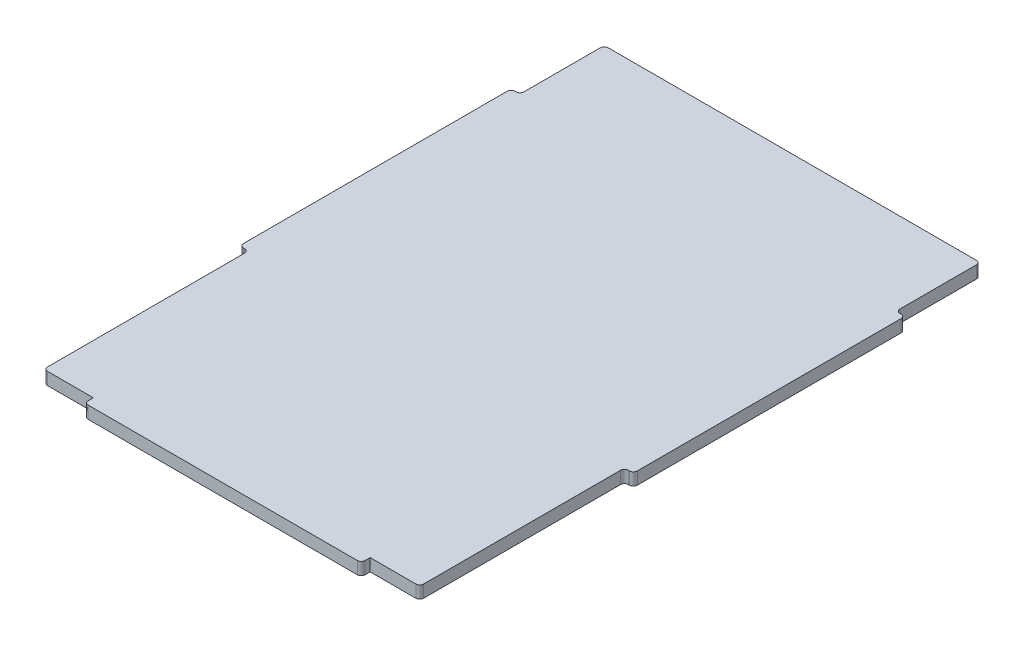
ISO-10303-21;
HEADER;
FILE_DESCRIPTION(('STEP AP214'),'2;1');
FILE_NAME('part.step','',(''),(''),'','','');
FILE_SCHEMA(('AUTOMOTIVE_DESIGN { 1 0 10303 214 1 1 1 1 }'));
ENDSEC;
DATA;
#1=APPLICATION_CONTEXT('core data for automotive mechanical design processes');
#2=APPLICATION_PROTOCOL_DEFINITION('international standard','automotive_design',2000,#1);
#3=PRODUCT_CONTEXT('',#1,'mechanical');
#4=PRODUCT('Part','Part','',(#3));
#5=PRODUCT_RELATED_PRODUCT_CATEGORY('part','',(#4));
#6=PRODUCT_DEFINITION_FORMATION('','',#4);
#7=PRODUCT_DEFINITION_CONTEXT('part definition',#1,'design');
#8=PRODUCT_DEFINITION('design','',#6,#7);
#9=PRODUCT_DEFINITION_SHAPE('','',#8);
#10=(LENGTH_UNIT() NAMED_UNIT(*) SI_UNIT(.MILLI.,.METRE.));
#11=(NAMED_UNIT(*) PLANE_ANGLE_UNIT() SI_UNIT($,.RADIAN.));
#12=(NAMED_UNIT(*) SI_UNIT($,.STERADIAN.) SOLID_ANGLE_UNIT());
#13=UNCERTAINTY_MEASURE_WITH_UNIT(LENGTH_MEASURE(1.E-05),#10,'distance_accuracy_value','');
#14=(GEOMETRIC_REPRESENTATION_CONTEXT(3) GLOBAL_UNCERTAINTY_ASSIGNED_CONTEXT((#13)) GLOBAL_UNIT_ASSIGNED_CONTEXT((#10,
#11,#12)) REPRESENTATION_CONTEXT('',''));
#15=CARTESIAN_POINT('',(0.,0.,0.));
#16=DIRECTION('',(0.,0.,1.));
#17=DIRECTION('',(1.,0.,0.));
#18=AXIS2_PLACEMENT_3D('',#15,#16,#17);
#19=CARTESIAN_POINT('',(96.3803,3.175,0.));
#20=DIRECTION('',(-1.,0.,0.));
#21=DIRECTION('',(0.,0.,1.));
#22=AXIS2_PLACEMENT_3D('',#19,#20,#21);
#23=PLANE('',#22);
#24=DIRECTION('',(0.,0.,-1.));
#25=VECTOR('',#24,1.);
#26=CARTESIAN_POINT('',(96.3803,3.175,0.));
#27=LINE('',#26,#25);
#28=CARTESIAN_POINT('',(96.3803,3.175,-1.));
#29=VERTEX_POINT('',#28);
#30=CARTESIAN_POINT('',(96.3803,3.175,-51.47894));
#31=VERTEX_POINT('',#30);
#32=EDGE_CURVE('E273',#29,#31,#27,.T.);
#33=ORIENTED_EDGE('',*,*,#32,.F.);
#34=DIRECTION('',(0.,-1.,0.));
#35=VECTOR('',#34,1.);
#36=CARTESIAN_POINT('',(96.3803,3.175,-1.));
#37=LINE('',#36,#35);
#38=CARTESIAN_POINT('',(96.3803,0.,-1.));
#39=VERTEX_POINT('',#38);
#40=EDGE_CURVE('E390',#29,#39,#37,.T.);
#41=ORIENTED_EDGE('',*,*,#40,.T.);
#42=DIRECTION('',(0.,0.,-1.));
#43=VECTOR('',#42,1.);
#44=CARTESIAN_POINT('',(96.3803,0.,0.));
#45=LINE('',#44,#43);
#46=CARTESIAN_POINT('',(96.3803,0.,-51.47894));
#47=VERTEX_POINT('',#46);
#48=EDGE_CURVE('E296',#39,#47,#45,.T.);
#49=ORIENTED_EDGE('',*,*,#48,.T.);
#50=DIRECTION('',(0.,-1.,0.));
#51=VECTOR('',#50,1.);
#52=CARTESIAN_POINT('',(96.3803,3.175,-51.47894));
#53=LINE('',#52,#51);
#54=EDGE_CURVE('E388',#47,#31,#53,.F.);
#55=ORIENTED_EDGE('',*,*,#54,.T.);
#56=EDGE_LOOP('',(#33,#41,#49,#55));
#57=FACE_BOUND('',#56,.T.);
#58=ADVANCED_FACE('F35',(#57),#23,.F.);
#59=CARTESIAN_POINT('',(0.,3.175,0.));
#60=DIRECTION('',(1.,0.,0.));
#61=DIRECTION('',(0.,0.,-1.));
#62=AXIS2_PLACEMENT_3D('',#59,#60,#61);
#63=PLANE('',#62);
#64=DIRECTION('',(0.,0.,1.));
#65=VECTOR('',#64,1.);
#66=CARTESIAN_POINT('',(0.,3.175,0.));
#67=LINE('',#66,#65);
#68=CARTESIAN_POINT('',(0.,3.175,-142.6878));
#69=VERTEX_POINT('',#68);
#70=CARTESIAN_POINT('',(0.,3.175,-123.095040291906));
#71=VERTEX_POINT('',#70);
#72=EDGE_CURVE('E245',#69,#71,#67,.T.);
#73=ORIENTED_EDGE('',*,*,#72,.F.);
#74=DIRECTION('',(0.,-1.,0.));
#75=VECTOR('',#74,1.);
#76=CARTESIAN_POINT('',(0.,3.175,-142.6878));
#77=LINE('',#76,#75);
#78=CARTESIAN_POINT('',(0.,0.,-142.6878));
#79=VERTEX_POINT('',#78);
#80=EDGE_CURVE('E354',#69,#79,#77,.T.);
#81=ORIENTED_EDGE('',*,*,#80,.T.);
#82=DIRECTION('',(0.,0.,1.));
#83=VECTOR('',#82,1.);
#84=CARTESIAN_POINT('',(0.,0.,0.));
#85=LINE('',#84,#83);
#86=CARTESIAN_POINT('',(0.,0.,-123.095040291906));
#87=VERTEX_POINT('',#86);
#88=EDGE_CURVE('E282',#79,#87,#85,.T.);
#89=ORIENTED_EDGE('',*,*,#88,.T.);
#90=DIRECTION('',(0.,-1.,0.));
#91=VECTOR('',#90,1.);
#92=CARTESIAN_POINT('',(0.,3.175,-123.095040291906));
#93=LINE('',#92,#91);
#94=EDGE_CURVE('E352',#87,#71,#93,.F.);
#95=ORIENTED_EDGE('',*,*,#94,.T.);
#96=EDGE_LOOP('',(#73,#81,#89,#95));
#97=FACE_BOUND('',#96,.T.);
#98=ADVANCED_FACE('F455',(#97),#63,.F.);
#99=CARTESIAN_POINT('',(0.,3.175,-51.47894));
#100=VERTEX_POINT('',#99);
#101=CARTESIAN_POINT('',(0.,3.175,-1.));
#102=VERTEX_POINT('',#101);
#103=EDGE_CURVE('E302',#100,#102,#67,.T.);
#104=ORIENTED_EDGE('',*,*,#103,.F.);
#105=DIRECTION('',(0.,-1.,0.));
#106=VECTOR('',#105,1.);
#107=CARTESIAN_POINT('',(0.,3.175,-51.47894));
#108=LINE('',#107,#106);
#109=CARTESIAN_POINT('',(0.,0.,-51.47894));
#110=VERTEX_POINT('',#109);
#111=EDGE_CURVE('E374',#100,#110,#108,.T.);
#112=ORIENTED_EDGE('',*,*,#111,.T.);
#113=CARTESIAN_POINT('',(0.,0.,-1.));
#114=VERTEX_POINT('',#113);
#115=EDGE_CURVE('E279',#110,#114,#85,.T.);
#116=ORIENTED_EDGE('',*,*,#115,.T.);
#117=DIRECTION('',(0.,-1.,0.));
#118=VECTOR('',#117,1.);
#119=CARTESIAN_POINT('',(0.,3.175,-1.));
#120=LINE('',#119,#118);
#121=EDGE_CURVE('E372',#114,#102,#120,.F.);
#122=ORIENTED_EDGE('',*,*,#121,.T.);
#123=EDGE_LOOP('',(#104,#112,#116,#122));
#124=FACE_BOUND('',#123,.T.);
#125=ADVANCED_FACE('F542',(#124),#63,.F.);
#126=CARTESIAN_POINT('',(0.,3.175,0.));
#127=DIRECTION('',(0.,0.,-1.));
#128=DIRECTION('',(-1.,0.,0.));
#129=AXIS2_PLACEMENT_3D('',#126,#127,#128);
#130=PLANE('',#129);
#131=DIRECTION('',(1.,0.,0.));
#132=VECTOR('',#131,1.);
#133=CARTESIAN_POINT('',(0.,3.175,0.));
#134=LINE('',#133,#132);
#135=CARTESIAN_POINT('',(1.,3.175,0.));
#136=VERTEX_POINT('',#135);
#137=CARTESIAN_POINT('',(12.7,3.175,0.));
#138=VERTEX_POINT('',#137);
#139=EDGE_CURVE('E232',#136,#138,#134,.T.);
#140=ORIENTED_EDGE('',*,*,#139,.F.);
#141=DIRECTION('',(0.,-1.,0.));
#142=VECTOR('',#141,1.);
#143=CARTESIAN_POINT('',(1.,3.175,0.));
#144=LINE('',#143,#142);
#145=CARTESIAN_POINT('',(1.,0.,0.));
#146=VERTEX_POINT('',#145);
#147=EDGE_CURVE('E377',#136,#146,#144,.T.);
#148=ORIENTED_EDGE('',*,*,#147,.T.);
#149=DIRECTION('',(1.,0.,0.));
#150=VECTOR('',#149,1.);
#151=CARTESIAN_POINT('',(0.,0.,0.));
#152=LINE('',#151,#150);
#153=CARTESIAN_POINT('',(12.7,0.,0.));
#154=VERTEX_POINT('',#153);
#155=EDGE_CURVE('E251',#146,#154,#152,.T.);
#156=ORIENTED_EDGE('',*,*,#155,.T.);
#157=DIRECTION('',(0.,-1.,0.));
#158=VECTOR('',#157,1.);
#159=CARTESIAN_POINT('',(12.7,3.175,0.));
#160=LINE('',#159,#158);
#161=EDGE_CURVE('E248',#138,#154,#160,.T.);
#162=ORIENTED_EDGE('',*,*,#161,.F.);
#163=EDGE_LOOP('',(#140,#148,#156,#162));
#164=FACE_BOUND('',#163,.T.);
#165=ADVANCED_FACE('F249',(#164),#130,.F.);
#166=CARTESIAN_POINT('',(12.7,3.175,2.286));
#167=DIRECTION('',(1.,0.,0.));
#168=DIRECTION('',(0.,0.,-1.));
#169=AXIS2_PLACEMENT_3D('',#166,#167,#168);
#170=PLANE('',#169);
#171=DIRECTION('',(0.,0.,1.));
#172=VECTOR('',#171,1.);
#173=CARTESIAN_POINT('',(12.7,0.,2.286));
#174=LINE('',#173,#172);
#175=CARTESIAN_POINT('',(12.7,0.,1.286));
#176=VERTEX_POINT('',#175);
#177=EDGE_CURVE('E285',#154,#176,#174,.T.);
#178=ORIENTED_EDGE('',*,*,#177,.T.);
#179=DIRECTION('',(0.,-1.,0.));
#180=VECTOR('',#179,1.);
#181=CARTESIAN_POINT('',(12.7,3.175,1.286));
#182=LINE('',#181,#180);
#183=CARTESIAN_POINT('',(12.7,3.175,1.286));
#184=VERTEX_POINT('',#183);
#185=EDGE_CURVE('E260',#176,#184,#182,.F.);
#186=ORIENTED_EDGE('',*,*,#185,.T.);
#187=DIRECTION('',(0.,0.,1.));
#188=VECTOR('',#187,1.);
#189=CARTESIAN_POINT('',(12.7,3.175,2.286));
#190=LINE('',#189,#188);
#191=EDGE_CURVE('E237',#138,#184,#190,.T.);
#192=ORIENTED_EDGE('',*,*,#191,.F.);
#193=ORIENTED_EDGE('',*,*,#161,.T.);
#194=EDGE_LOOP('',(#178,#186,#192,#193));
#195=FACE_BOUND('',#194,.T.);
#196=ADVANCED_FACE('F258',(#195),#170,.F.);
#197=CARTESIAN_POINT('',(12.7,3.175,2.286));
#198=DIRECTION('',(0.,0.,-1.));
#199=DIRECTION('',(-1.,0.,0.));
#200=AXIS2_PLACEMENT_3D('',#197,#198,#199);
#201=PLANE('',#200);
#202=DIRECTION('',(1.,0.,0.));
#203=VECTOR('',#202,1.);
#204=CARTESIAN_POINT('',(12.7,3.175,2.286));
#205=LINE('',#204,#203);
#206=CARTESIAN_POINT('',(13.7,3.175,2.286));
#207=VERTEX_POINT('',#206);
#208=CARTESIAN_POINT('',(82.6803,3.175,2.28599999999999));
#209=VERTEX_POINT('',#208);
#210=EDGE_CURVE('E261',#207,#209,#205,.T.);
#211=ORIENTED_EDGE('',*,*,#210,.F.);
#212=DIRECTION('',(0.,-1.,0.));
#213=VECTOR('',#212,1.);
#214=CARTESIAN_POINT('',(13.7,3.175,2.286));
#215=LINE('',#214,#213);
#216=CARTESIAN_POINT('',(13.7,0.,2.286));
#217=VERTEX_POINT('',#216);
#218=EDGE_CURVE('E381',#207,#217,#215,.T.);
#219=ORIENTED_EDGE('',*,*,#218,.T.);
#220=DIRECTION('',(1.,0.,0.));
#221=VECTOR('',#220,1.);
#222=CARTESIAN_POINT('',(12.7,0.,2.286));
#223=LINE('',#222,#221);
#224=CARTESIAN_POINT('',(82.6803,0.,2.28599999999999));
#225=VERTEX_POINT('',#224);
#226=EDGE_CURVE('E287',#217,#225,#223,.T.);
#227=ORIENTED_EDGE('',*,*,#226,.T.);
#228=DIRECTION('',(0.,-1.,0.));
#229=VECTOR('',#228,1.);
#230=CARTESIAN_POINT('',(82.6803,3.175,2.28599999999999));
#231=LINE('',#230,#229);
#232=EDGE_CURVE('E379',#225,#209,#231,.F.);
#233=ORIENTED_EDGE('',*,*,#232,.T.);
#234=EDGE_LOOP('',(#211,#219,#227,#233));
#235=FACE_BOUND('',#234,.T.);
#236=ADVANCED_FACE('F531',(#235),#201,.F.);
#237=CARTESIAN_POINT('',(83.6803,3.175,2.28599999999999));
#238=DIRECTION('',(-1.,0.,0.));
#239=DIRECTION('',(0.,0.,1.));
#240=AXIS2_PLACEMENT_3D('',#237,#238,#239);
#241=PLANE('',#240);
#242=DIRECTION('',(0.,0.,-1.));
#243=VECTOR('',#242,1.);
#244=CARTESIAN_POINT('',(83.6803,3.175,2.28599999999999));
#245=LINE('',#244,#243);
#246=CARTESIAN_POINT('',(83.6803,3.175,1.28599999999999));
#247=VERTEX_POINT('',#246);
#248=CARTESIAN_POINT('',(83.6803,3.175,0.));
#249=VERTEX_POINT('',#248);
#250=EDGE_CURVE('E264',#247,#249,#245,.T.);
#251=ORIENTED_EDGE('',*,*,#250,.F.);
#252=DIRECTION('',(0.,-1.,0.));
#253=VECTOR('',#252,1.);
#254=CARTESIAN_POINT('',(83.6803,3.175,1.28599999999999));
#255=LINE('',#254,#253);
#256=CARTESIAN_POINT('',(83.6803,0.,1.28599999999999));
#257=VERTEX_POINT('',#256);
#258=EDGE_CURVE('E385',#247,#257,#255,.T.);
#259=ORIENTED_EDGE('',*,*,#258,.T.);
#260=DIRECTION('',(0.,0.,-1.));
#261=VECTOR('',#260,1.);
#262=CARTESIAN_POINT('',(83.6803,0.,2.28599999999999));
#263=LINE('',#262,#261);
#264=CARTESIAN_POINT('',(83.6803,0.,0.));
#265=VERTEX_POINT('',#264);
#266=EDGE_CURVE('E290',#257,#265,#263,.T.);
#267=ORIENTED_EDGE('',*,*,#266,.T.);
#268=DIRECTION('',(0.,-1.,0.));
#269=VECTOR('',#268,1.);
#270=CARTESIAN_POINT('',(83.6803,3.175,0.));
#271=LINE('',#270,#269);
#272=EDGE_CURVE('E256',#249,#265,#271,.T.);
#273=ORIENTED_EDGE('',*,*,#272,.F.);
#274=EDGE_LOOP('',(#251,#259,#267,#273));
#275=FACE_BOUND('',#274,.T.);
#276=ADVANCED_FACE('F524',(#275),#241,.F.);
#277=CARTESIAN_POINT('',(83.6803,3.175,0.));
#278=DIRECTION('',(0.,0.,-1.));
#279=DIRECTION('',(-1.,0.,0.));
#280=AXIS2_PLACEMENT_3D('',#277,#278,#279);
#281=PLANE('',#280);
#282=DIRECTION('',(1.,0.,0.));
#283=VECTOR('',#282,1.);
#284=CARTESIAN_POINT('',(83.6803,0.,0.));
#285=LINE('',#284,#283);
#286=CARTESIAN_POINT('',(95.3803,0.,0.));
#287=VERTEX_POINT('',#286);
#288=EDGE_CURVE('E292',#265,#287,#285,.T.);
#289=ORIENTED_EDGE('',*,*,#288,.T.);
#290=DIRECTION('',(0.,-1.,0.));
#291=VECTOR('',#290,1.);
#292=CARTESIAN_POINT('',(95.3803,3.175,0.));
#293=LINE('',#292,#291);
#294=CARTESIAN_POINT('',(95.3803,3.175,0.));
#295=VERTEX_POINT('',#294);
#296=EDGE_CURVE('E393',#287,#295,#293,.F.);
#297=ORIENTED_EDGE('',*,*,#296,.T.);
#298=DIRECTION('',(1.,0.,0.));
#299=VECTOR('',#298,1.);
#300=CARTESIAN_POINT('',(83.6803,3.175,0.));
#301=LINE('',#300,#299);
#302=EDGE_CURVE('E269',#249,#295,#301,.T.);
#303=ORIENTED_EDGE('',*,*,#302,.F.);
#304=ORIENTED_EDGE('',*,*,#272,.T.);
#305=EDGE_LOOP('',(#289,#297,#303,#304));
#306=FACE_BOUND('',#305,.T.);
#307=ADVANCED_FACE('F519',(#306),#281,.F.);
#308=CARTESIAN_POINT('',(96.3803,0.,-123.095040291906));
#309=VERTEX_POINT('',#308);
#310=CARTESIAN_POINT('',(96.3803,0.,-142.6878));
#311=VERTEX_POINT('',#310);
#312=EDGE_CURVE('E295',#309,#311,#45,.T.);
#313=ORIENTED_EDGE('',*,*,#312,.T.);
#314=DIRECTION('',(0.,-1.,0.));
#315=VECTOR('',#314,1.);
#316=CARTESIAN_POINT('',(96.3803,3.175,-142.6878));
#317=LINE('',#316,#315);
#318=CARTESIAN_POINT('',(96.3803,3.175,-142.6878));
#319=VERTEX_POINT('',#318);
#320=EDGE_CURVE('E332',#311,#319,#317,.F.);
#321=ORIENTED_EDGE('',*,*,#320,.T.);
#322=CARTESIAN_POINT('',(96.3803,3.175,-123.095040291906));
#323=VERTEX_POINT('',#322);
#324=EDGE_CURVE('E272',#323,#319,#27,.T.);
#325=ORIENTED_EDGE('',*,*,#324,.F.);
#326=DIRECTION('',(0.,-1.,0.));
#327=VECTOR('',#326,1.);
#328=CARTESIAN_POINT('',(96.3803,3.175,-123.095040291906));
#329=LINE('',#328,#327);
#330=EDGE_CURVE('E329',#323,#309,#329,.T.);
#331=ORIENTED_EDGE('',*,*,#330,.T.);
#332=EDGE_LOOP('',(#313,#321,#325,#331));
#333=FACE_BOUND('',#332,.T.);
#334=ADVANCED_FACE('F438',(#333),#23,.F.);
#335=CARTESIAN_POINT('',(0.,3.175,-143.6878));
#336=DIRECTION('',(0.,0.,1.));
#337=DIRECTION('',(1.,0.,0.));
#338=AXIS2_PLACEMENT_3D('',#335,#336,#337);
#339=PLANE('',#338);
#340=DIRECTION('',(-1.,0.,0.));
#341=VECTOR('',#340,1.);
#342=CARTESIAN_POINT('',(0.,3.175,-143.6878));
#343=LINE('',#342,#341);
#344=CARTESIAN_POINT('',(95.3803,3.175,-143.6878));
#345=VERTEX_POINT('',#344);
#346=CARTESIAN_POINT('',(1.,3.175,-143.6878));
#347=VERTEX_POINT('',#346);
#348=EDGE_CURVE('E276',#345,#347,#343,.T.);
#349=ORIENTED_EDGE('',*,*,#348,.F.);
#350=DIRECTION('',(0.,-1.,0.));
#351=VECTOR('',#350,1.);
#352=CARTESIAN_POINT('',(95.3803,3.175,-143.6878));
#353=LINE('',#352,#351);
#354=CARTESIAN_POINT('',(95.3803,0.,-143.6878));
#355=VERTEX_POINT('',#354);
#356=EDGE_CURVE('E306',#345,#355,#353,.T.);
#357=ORIENTED_EDGE('',*,*,#356,.T.);
#358=DIRECTION('',(-1.,0.,0.));
#359=VECTOR('',#358,1.);
#360=CARTESIAN_POINT('',(0.,0.,-143.6878));
#361=LINE('',#360,#359);
#362=CARTESIAN_POINT('',(1.,0.,-143.6878));
#363=VERTEX_POINT('',#362);
#364=EDGE_CURVE('E299',#355,#363,#361,.T.);
#365=ORIENTED_EDGE('',*,*,#364,.T.);
#366=DIRECTION('',(0.,-1.,0.));
#367=VECTOR('',#366,1.);
#368=CARTESIAN_POINT('',(1.,3.175,-143.6878));
#369=LINE('',#368,#367);
#370=EDGE_CURVE('E255',#363,#347,#369,.F.);
#371=ORIENTED_EDGE('',*,*,#370,.T.);
#372=EDGE_LOOP('',(#349,#357,#365,#371));
#373=FACE_BOUND('',#372,.T.);
#374=ADVANCED_FACE('F446',(#373),#339,.F.);
#375=CARTESIAN_POINT('',(0.,3.175,0.));
#376=DIRECTION('',(0.,-1.,0.));
#377=DIRECTION('',(0.,0.,-1.));
#378=AXIS2_PLACEMENT_3D('',#375,#376,#377);
#379=PLANE('',#378);
#380=ORIENTED_EDGE('',*,*,#324,.T.);
#381=CARTESIAN_POINT('',(95.3803,3.175,-142.6878));
#382=DIRECTION('',(0.,-1.,0.));
#383=DIRECTION('',(0.,0.,-1.));
#384=AXIS2_PLACEMENT_3D('',#381,#382,#383);
#385=CIRCLE('',#384,1.);
#386=EDGE_CURVE('E350',#319,#345,#385,.F.);
#387=ORIENTED_EDGE('',*,*,#386,.T.);
#388=ORIENTED_EDGE('',*,*,#348,.T.);
#389=CARTESIAN_POINT('',(1.,3.175,-142.6878));
#390=DIRECTION('',(0.,-1.,0.));
#391=DIRECTION('',(0.,0.,-1.));
#392=AXIS2_PLACEMENT_3D('',#389,#390,#391);
#393=CIRCLE('',#392,1.);
#394=EDGE_CURVE('E348',#347,#69,#393,.F.);
#395=ORIENTED_EDGE('',*,*,#394,.T.);
#396=ORIENTED_EDGE('',*,*,#72,.T.);
#397=CARTESIAN_POINT('',(-1.,3.175,-123.095040291906));
#398=DIRECTION('',(0.,-1.,0.));
#399=DIRECTION('',(0.,0.,-1.));
#400=AXIS2_PLACEMENT_3D('',#397,#398,#399);
#401=CIRCLE('',#400,1.);
#402=CARTESIAN_POINT('',(-1.,3.175,-122.095040291906));
#403=VERTEX_POINT('',#402);
#404=EDGE_CURVE('E411',#71,#403,#401,.T.);
#405=ORIENTED_EDGE('',*,*,#404,.T.);
#406=DIRECTION('',(1.,0.,0.));
#407=VECTOR('',#406,1.);
#408=CARTESIAN_POINT('',(0.,3.175,-122.095040291906));
#409=LINE('',#408,#407);
#410=CARTESIAN_POINT('',(-1.28599999999999,3.175,-122.095040291906));
#411=VERTEX_POINT('',#410);
#412=EDGE_CURVE('E283',#411,#403,#409,.T.);
#413=ORIENTED_EDGE('',*,*,#412,.F.);
#414=CARTESIAN_POINT('',(-1.28599999999999,3.175,-121.095040291906));
#415=DIRECTION('',(0.,-1.,0.));
#416=DIRECTION('',(0.,0.,-1.));
#417=AXIS2_PLACEMENT_3D('',#414,#415,#416);
#418=CIRCLE('',#417,1.);
#419=CARTESIAN_POINT('',(-2.28599999999999,3.175,-121.095040291906));
#420=VERTEX_POINT('',#419);
#421=EDGE_CURVE('E346',#411,#420,#418,.F.);
#422=ORIENTED_EDGE('',*,*,#421,.T.);
#423=DIRECTION('',(0.,0.,-1.));
#424=VECTOR('',#423,1.);
#425=CARTESIAN_POINT('',(-2.286,3.175,-52.47894));
#426=LINE('',#425,#424);
#427=CARTESIAN_POINT('',(-2.286,3.175,-53.47894));
#428=VERTEX_POINT('',#427);
#429=EDGE_CURVE('E473',#428,#420,#426,.T.);
#430=ORIENTED_EDGE('',*,*,#429,.F.);
#431=CARTESIAN_POINT('',(-1.286,3.175,-53.47894));
#432=DIRECTION('',(0.,-1.,0.));
#433=DIRECTION('',(0.,0.,-1.));
#434=AXIS2_PLACEMENT_3D('',#431,#432,#433);
#435=CIRCLE('',#434,1.);
#436=CARTESIAN_POINT('',(-1.286,3.175,-52.47894));
#437=VERTEX_POINT('',#436);
#438=EDGE_CURVE('E344',#428,#437,#435,.F.);
#439=ORIENTED_EDGE('',*,*,#438,.T.);
#440=DIRECTION('',(-1.,0.,0.));
#441=VECTOR('',#440,1.);
#442=CARTESIAN_POINT('',(0.,3.175,-52.47894));
#443=LINE('',#442,#441);
#444=CARTESIAN_POINT('',(-1.,3.175,-52.47894));
#445=VERTEX_POINT('',#444);
#446=EDGE_CURVE('E463',#445,#437,#443,.T.);
#447=ORIENTED_EDGE('',*,*,#446,.F.);
#448=CARTESIAN_POINT('',(-1.,3.175,-51.47894));
#449=DIRECTION('',(0.,-1.,0.));
#450=DIRECTION('',(0.,0.,-1.));
#451=AXIS2_PLACEMENT_3D('',#448,#449,#450);
#452=CIRCLE('',#451,1.);
#453=EDGE_CURVE('E415',#445,#100,#452,.T.);
#454=ORIENTED_EDGE('',*,*,#453,.T.);
#455=ORIENTED_EDGE('',*,*,#103,.T.);
#456=CARTESIAN_POINT('',(1.,3.175,-1.));
#457=DIRECTION('',(0.,-1.,0.));
#458=DIRECTION('',(0.,0.,-1.));
#459=AXIS2_PLACEMENT_3D('',#456,#457,#458);
#460=CIRCLE('',#459,1.);
#461=EDGE_CURVE('E241',#102,#136,#460,.F.);
#462=ORIENTED_EDGE('',*,*,#461,.T.);
#463=ORIENTED_EDGE('',*,*,#139,.T.);
#464=ORIENTED_EDGE('',*,*,#191,.T.);
#465=CARTESIAN_POINT('',(13.7,3.175,1.286));
#466=DIRECTION('',(0.,-1.,0.));
#467=DIRECTION('',(0.,0.,-1.));
#468=AXIS2_PLACEMENT_3D('',#465,#466,#467);
#469=CIRCLE('',#468,1.);
#470=EDGE_CURVE('E341',#184,#207,#469,.F.);
#471=ORIENTED_EDGE('',*,*,#470,.T.);
#472=ORIENTED_EDGE('',*,*,#210,.T.);
#473=CARTESIAN_POINT('',(82.6803,3.175,1.28599999999999));
#474=DIRECTION('',(0.,-1.,0.));
#475=DIRECTION('',(0.,0.,-1.));
#476=AXIS2_PLACEMENT_3D('',#473,#474,#475);
#477=CIRCLE('',#476,1.);
#478=EDGE_CURVE('E339',#209,#247,#477,.F.);
#479=ORIENTED_EDGE('',*,*,#478,.T.);
#480=ORIENTED_EDGE('',*,*,#250,.T.);
#481=ORIENTED_EDGE('',*,*,#302,.T.);
#482=CARTESIAN_POINT('',(95.3803,3.175,-1.));
#483=DIRECTION('',(0.,-1.,0.));
#484=DIRECTION('',(0.,0.,-1.));
#485=AXIS2_PLACEMENT_3D('',#482,#483,#484);
#486=CIRCLE('',#485,1.);
#487=EDGE_CURVE('E337',#295,#29,#486,.F.);
#488=ORIENTED_EDGE('',*,*,#487,.T.);
#489=ORIENTED_EDGE('',*,*,#32,.T.);
#490=CARTESIAN_POINT('',(97.3803,3.175,-51.47894));
#491=DIRECTION('',(0.,-1.,0.));
#492=DIRECTION('',(0.,0.,-1.));
#493=AXIS2_PLACEMENT_3D('',#490,#491,#492);
#494=CIRCLE('',#493,1.);
#495=CARTESIAN_POINT('',(97.3803,3.175,-52.47894));
#496=VERTEX_POINT('',#495);
#497=EDGE_CURVE('E419',#31,#496,#494,.T.);
#498=ORIENTED_EDGE('',*,*,#497,.T.);
#499=DIRECTION('',(-1.,0.,0.));
#500=VECTOR('',#499,1.);
#501=CARTESIAN_POINT('',(96.3803,3.175,-52.47894));
#502=LINE('',#501,#500);
#503=CARTESIAN_POINT('',(97.6663,3.175,-52.47894));
#504=VERTEX_POINT('',#503);
#505=EDGE_CURVE('E470',#504,#496,#502,.T.);
#506=ORIENTED_EDGE('',*,*,#505,.F.);
#507=CARTESIAN_POINT('',(97.6663,3.175,-53.47894));
#508=DIRECTION('',(0.,-1.,0.));
#509=DIRECTION('',(0.,0.,-1.));
#510=AXIS2_PLACEMENT_3D('',#507,#508,#509);
#511=CIRCLE('',#510,1.);
#512=CARTESIAN_POINT('',(98.6663,3.175,-53.47894));
#513=VERTEX_POINT('',#512);
#514=EDGE_CURVE('E335',#504,#513,#511,.F.);
#515=ORIENTED_EDGE('',*,*,#514,.T.);
#516=DIRECTION('',(0.,0.,1.));
#517=VECTOR('',#516,1.);
#518=CARTESIAN_POINT('',(98.6663,3.175,-52.47894));
#519=LINE('',#518,#517);
#520=CARTESIAN_POINT('',(98.6663,3.175,-121.095040291906));
#521=VERTEX_POINT('',#520);
#522=EDGE_CURVE('E485',#521,#513,#519,.T.);
#523=ORIENTED_EDGE('',*,*,#522,.F.);
#524=CARTESIAN_POINT('',(97.6663,3.175,-121.095040291906));
#525=DIRECTION('',(0.,-1.,0.));
#526=DIRECTION('',(0.,0.,-1.));
#527=AXIS2_PLACEMENT_3D('',#524,#525,#526);
#528=CIRCLE('',#527,1.);
#529=CARTESIAN_POINT('',(97.6663,3.175,-122.095040291906));
#530=VERTEX_POINT('',#529);
#531=EDGE_CURVE('E50',#521,#530,#528,.F.);
#532=ORIENTED_EDGE('',*,*,#531,.T.);
#533=DIRECTION('',(1.,0.,0.));
#534=VECTOR('',#533,1.);
#535=CARTESIAN_POINT('',(96.3803,3.175,-122.095040291906));
#536=LINE('',#535,#534);
#537=CARTESIAN_POINT('',(97.3803,3.175,-122.095040291906));
#538=VERTEX_POINT('',#537);
#539=EDGE_CURVE('E436',#538,#530,#536,.T.);
#540=ORIENTED_EDGE('',*,*,#539,.F.);
#541=CARTESIAN_POINT('',(97.3803,3.175,-123.095040291906));
#542=DIRECTION('',(0.,-1.,0.));
#543=DIRECTION('',(0.,0.,-1.));
#544=AXIS2_PLACEMENT_3D('',#541,#542,#543);
#545=CIRCLE('',#544,1.);
#546=EDGE_CURVE('E11',#538,#323,#545,.T.);
#547=ORIENTED_EDGE('',*,*,#546,.T.);
#548=EDGE_LOOP('',(#380,#387,#388,#395,#396,#405,#413,#422,#430,#439,#447,#454,#455,#462,#463,
#464,#471,#472,#479,#480,#481,#488,#489,#498,#506,#515,#523,#532,#540,#547));
#549=FACE_BOUND('',#548,.T.);
#550=ADVANCED_FACE('F235',(#549),#379,.F.);
#551=CARTESIAN_POINT('',(0.,0.,0.));
#552=DIRECTION('',(0.,-1.,0.));
#553=DIRECTION('',(0.,0.,-1.));
#554=AXIS2_PLACEMENT_3D('',#551,#552,#553);
#555=PLANE('',#554);
#556=ORIENTED_EDGE('',*,*,#364,.F.);
#557=CARTESIAN_POINT('',(95.3803,0.,-142.6878));
#558=DIRECTION('',(0.,-1.,0.));
#559=DIRECTION('',(0.,0.,-1.));
#560=AXIS2_PLACEMENT_3D('',#557,#558,#559);
#561=CIRCLE('',#560,1.);
#562=EDGE_CURVE('E327',#355,#311,#561,.T.);
#563=ORIENTED_EDGE('',*,*,#562,.T.);
#564=ORIENTED_EDGE('',*,*,#312,.F.);
#565=CARTESIAN_POINT('',(97.3803,0.,-123.095040291906));
#566=DIRECTION('',(0.,-1.,0.));
#567=DIRECTION('',(0.,0.,-1.));
#568=AXIS2_PLACEMENT_3D('',#565,#566,#567);
#569=CIRCLE('',#568,1.);
#570=CARTESIAN_POINT('',(97.3803,0.,-122.095040291906));
#571=VERTEX_POINT('',#570);
#572=EDGE_CURVE('E43',#309,#571,#569,.F.);
#573=ORIENTED_EDGE('',*,*,#572,.T.);
#574=DIRECTION('',(1.,0.,0.));
#575=VECTOR('',#574,1.);
#576=CARTESIAN_POINT('',(96.3803,0.,-122.095040291906));
#577=LINE('',#576,#575);
#578=CARTESIAN_POINT('',(97.6663,0.,-122.095040291906));
#579=VERTEX_POINT('',#578);
#580=EDGE_CURVE('E425',#571,#579,#577,.T.);
#581=ORIENTED_EDGE('',*,*,#580,.T.);
#582=CARTESIAN_POINT('',(97.6663,0.,-121.095040291906));
#583=DIRECTION('',(0.,-1.,0.));
#584=DIRECTION('',(0.,0.,-1.));
#585=AXIS2_PLACEMENT_3D('',#582,#583,#584);
#586=CIRCLE('',#585,1.);
#587=CARTESIAN_POINT('',(98.6663,0.,-121.095040291906));
#588=VERTEX_POINT('',#587);
#589=EDGE_CURVE('E309',#579,#588,#586,.T.);
#590=ORIENTED_EDGE('',*,*,#589,.T.);
#591=DIRECTION('',(0.,0.,1.));
#592=VECTOR('',#591,1.);
#593=CARTESIAN_POINT('',(98.6663,0.,-52.47894));
#594=LINE('',#593,#592);
#595=CARTESIAN_POINT('',(98.6663,0.,-53.47894));
#596=VERTEX_POINT('',#595);
#597=EDGE_CURVE('E431',#588,#596,#594,.T.);
#598=ORIENTED_EDGE('',*,*,#597,.T.);
#599=CARTESIAN_POINT('',(97.6663,0.,-53.47894));
#600=DIRECTION('',(0.,-1.,0.));
#601=DIRECTION('',(0.,0.,-1.));
#602=AXIS2_PLACEMENT_3D('',#599,#600,#601);
#603=CIRCLE('',#602,1.);
#604=CARTESIAN_POINT('',(97.6663,0.,-52.47894));
#605=VERTEX_POINT('',#604);
#606=EDGE_CURVE('E311',#596,#605,#603,.T.);
#607=ORIENTED_EDGE('',*,*,#606,.T.);
#608=DIRECTION('',(-1.,0.,0.));
#609=VECTOR('',#608,1.);
#610=CARTESIAN_POINT('',(96.3803,0.,-52.47894));
#611=LINE('',#610,#609);
#612=CARTESIAN_POINT('',(97.3803,0.,-52.47894));
#613=VERTEX_POINT('',#612);
#614=EDGE_CURVE('E478',#605,#613,#611,.T.);
#615=ORIENTED_EDGE('',*,*,#614,.T.);
#616=CARTESIAN_POINT('',(97.3803,0.,-51.47894));
#617=DIRECTION('',(0.,-1.,0.));
#618=DIRECTION('',(0.,0.,-1.));
#619=AXIS2_PLACEMENT_3D('',#616,#617,#618);
#620=CIRCLE('',#619,1.);
#621=EDGE_CURVE('E417',#613,#47,#620,.F.);
#622=ORIENTED_EDGE('',*,*,#621,.T.);
#623=ORIENTED_EDGE('',*,*,#48,.F.);
#624=CARTESIAN_POINT('',(95.3803,0.,-1.));
#625=DIRECTION('',(0.,-1.,0.));
#626=DIRECTION('',(0.,0.,-1.));
#627=AXIS2_PLACEMENT_3D('',#624,#625,#626);
#628=CIRCLE('',#627,1.);
#629=EDGE_CURVE('E313',#39,#287,#628,.T.);
#630=ORIENTED_EDGE('',*,*,#629,.T.);
#631=ORIENTED_EDGE('',*,*,#288,.F.);
#632=ORIENTED_EDGE('',*,*,#266,.F.);
#633=CARTESIAN_POINT('',(82.6803,0.,1.28599999999999));
#634=DIRECTION('',(0.,-1.,0.));
#635=DIRECTION('',(0.,0.,-1.));
#636=AXIS2_PLACEMENT_3D('',#633,#634,#635);
#637=CIRCLE('',#636,1.);
#638=EDGE_CURVE('E315',#257,#225,#637,.T.);
#639=ORIENTED_EDGE('',*,*,#638,.T.);
#640=ORIENTED_EDGE('',*,*,#226,.F.);
#641=CARTESIAN_POINT('',(13.7,0.,1.286));
#642=DIRECTION('',(0.,-1.,0.));
#643=DIRECTION('',(0.,0.,-1.));
#644=AXIS2_PLACEMENT_3D('',#641,#642,#643);
#645=CIRCLE('',#644,1.);
#646=EDGE_CURVE('E317',#217,#176,#645,.T.);
#647=ORIENTED_EDGE('',*,*,#646,.T.);
#648=ORIENTED_EDGE('',*,*,#177,.F.);
#649=ORIENTED_EDGE('',*,*,#155,.F.);
#650=CARTESIAN_POINT('',(1.,0.,-1.));
#651=DIRECTION('',(0.,-1.,0.));
#652=DIRECTION('',(0.,0.,-1.));
#653=AXIS2_PLACEMENT_3D('',#650,#651,#652);
#654=CIRCLE('',#653,1.);
#655=EDGE_CURVE('E319',#146,#114,#654,.T.);
#656=ORIENTED_EDGE('',*,*,#655,.T.);
#657=ORIENTED_EDGE('',*,*,#115,.F.);
#658=CARTESIAN_POINT('',(-1.,0.,-51.47894));
#659=DIRECTION('',(0.,-1.,0.));
#660=DIRECTION('',(0.,0.,-1.));
#661=AXIS2_PLACEMENT_3D('',#658,#659,#660);
#662=CIRCLE('',#661,1.);
#663=CARTESIAN_POINT('',(-1.,0.,-52.47894));
#664=VERTEX_POINT('',#663);
#665=EDGE_CURVE('E413',#110,#664,#662,.F.);
#666=ORIENTED_EDGE('',*,*,#665,.T.);
#667=DIRECTION('',(-1.,0.,0.));
#668=VECTOR('',#667,1.);
#669=CARTESIAN_POINT('',(0.,0.,-52.47894));
#670=LINE('',#669,#668);
#671=CARTESIAN_POINT('',(-1.286,0.,-52.47894));
#672=VERTEX_POINT('',#671);
#673=EDGE_CURVE('E467',#664,#672,#670,.T.);
#674=ORIENTED_EDGE('',*,*,#673,.T.);
#675=CARTESIAN_POINT('',(-1.286,0.,-53.47894));
#676=DIRECTION('',(0.,-1.,0.));
#677=DIRECTION('',(0.,0.,-1.));
#678=AXIS2_PLACEMENT_3D('',#675,#676,#677);
#679=CIRCLE('',#678,1.);
#680=CARTESIAN_POINT('',(-2.286,0.,-53.47894));
#681=VERTEX_POINT('',#680);
#682=EDGE_CURVE('E321',#672,#681,#679,.T.);
#683=ORIENTED_EDGE('',*,*,#682,.T.);
#684=DIRECTION('',(0.,0.,-1.));
#685=VECTOR('',#684,1.);
#686=CARTESIAN_POINT('',(-2.286,0.,-52.47894));
#687=LINE('',#686,#685);
#688=CARTESIAN_POINT('',(-2.28599999999999,0.,-121.095040291906));
#689=VERTEX_POINT('',#688);
#690=EDGE_CURVE('E464',#681,#689,#687,.T.);
#691=ORIENTED_EDGE('',*,*,#690,.T.);
#692=CARTESIAN_POINT('',(-1.28599999999999,0.,-121.095040291906));
#693=DIRECTION('',(0.,-1.,0.));
#694=DIRECTION('',(0.,0.,-1.));
#695=AXIS2_PLACEMENT_3D('',#692,#693,#694);
#696=CIRCLE('',#695,1.);
#697=CARTESIAN_POINT('',(-1.28599999999999,0.,-122.095040291906));
#698=VERTEX_POINT('',#697);
#699=EDGE_CURVE('E323',#689,#698,#696,.T.);
#700=ORIENTED_EDGE('',*,*,#699,.T.);
#701=DIRECTION('',(1.,0.,0.));
#702=VECTOR('',#701,1.);
#703=CARTESIAN_POINT('',(0.,0.,-122.095040291906));
#704=LINE('',#703,#702);
#705=CARTESIAN_POINT('',(-1.,0.,-122.095040291906));
#706=VERTEX_POINT('',#705);
#707=EDGE_CURVE('E460',#698,#706,#704,.T.);
#708=ORIENTED_EDGE('',*,*,#707,.T.);
#709=CARTESIAN_POINT('',(-1.,0.,-123.095040291906));
#710=DIRECTION('',(0.,-1.,0.));
#711=DIRECTION('',(0.,0.,-1.));
#712=AXIS2_PLACEMENT_3D('',#709,#710,#711);
#713=CIRCLE('',#712,1.);
#714=EDGE_CURVE('E409',#706,#87,#713,.F.);
#715=ORIENTED_EDGE('',*,*,#714,.T.);
#716=ORIENTED_EDGE('',*,*,#88,.F.);
#717=CARTESIAN_POINT('',(1.,0.,-142.6878));
#718=DIRECTION('',(0.,-1.,0.));
#719=DIRECTION('',(0.,0.,-1.));
#720=AXIS2_PLACEMENT_3D('',#717,#718,#719);
#721=CIRCLE('',#720,1.);
#722=EDGE_CURVE('E325',#79,#363,#721,.T.);
#723=ORIENTED_EDGE('',*,*,#722,.T.);
#724=EDGE_LOOP('',(#556,#563,#564,#573,#581,#590,#598,#607,#615,#622,#623,#630,#631,#632,#639,
#640,#647,#648,#649,#656,#657,#666,#674,#683,#691,#700,#708,#715,#716,#723));
#725=FACE_BOUND('',#724,.T.);
#726=ADVANCED_FACE('F424',(#725),#555,.T.);
#727=CARTESIAN_POINT('',(0.,3.175,-122.095040291906));
#728=DIRECTION('',(0.,0.,-1.));
#729=DIRECTION('',(-1.,0.,0.));
#730=AXIS2_PLACEMENT_3D('',#727,#728,#729);
#731=PLANE('',#730);
#732=ORIENTED_EDGE('',*,*,#412,.T.);
#733=DIRECTION('',(0.,-1.,0.));
#734=VECTOR('',#733,1.);
#735=CARTESIAN_POINT('',(-1.,3.175,-122.095040291906));
#736=LINE('',#735,#734);
#737=EDGE_CURVE('E359',#403,#706,#736,.T.);
#738=ORIENTED_EDGE('',*,*,#737,.T.);
#739=ORIENTED_EDGE('',*,*,#707,.F.);
#740=DIRECTION('',(0.,-1.,0.));
#741=VECTOR('',#740,1.);
#742=CARTESIAN_POINT('',(-1.28599999999999,3.175,-122.095040291906));
#743=LINE('',#742,#741);
#744=EDGE_CURVE('E357',#698,#411,#743,.F.);
#745=ORIENTED_EDGE('',*,*,#744,.T.);
#746=EDGE_LOOP('',(#732,#738,#739,#745));
#747=FACE_BOUND('',#746,.T.);
#748=ADVANCED_FACE('F615',(#747),#731,.T.);
#749=CARTESIAN_POINT('',(-2.286,3.175,-52.47894));
#750=DIRECTION('',(-1.,0.,0.));
#751=DIRECTION('',(0.,0.,1.));
#752=AXIS2_PLACEMENT_3D('',#749,#750,#751);
#753=PLANE('',#752);
#754=ORIENTED_EDGE('',*,*,#429,.T.);
#755=DIRECTION('',(0.,-1.,0.));
#756=VECTOR('',#755,1.);
#757=CARTESIAN_POINT('',(-2.28599999999999,3.175,-121.095040291906));
#758=LINE('',#757,#756);
#759=EDGE_CURVE('E364',#420,#689,#758,.T.);
#760=ORIENTED_EDGE('',*,*,#759,.T.);
#761=ORIENTED_EDGE('',*,*,#690,.F.);
#762=DIRECTION('',(0.,-1.,0.));
#763=VECTOR('',#762,1.);
#764=CARTESIAN_POINT('',(-2.286,3.175,-53.47894));
#765=LINE('',#764,#763);
#766=EDGE_CURVE('E362',#681,#428,#765,.F.);
#767=ORIENTED_EDGE('',*,*,#766,.T.);
#768=EDGE_LOOP('',(#754,#760,#761,#767));
#769=FACE_BOUND('',#768,.T.);
#770=ADVANCED_FACE('F609',(#769),#753,.T.);
#771=CARTESIAN_POINT('',(0.,3.175,-52.47894));
#772=DIRECTION('',(0.,0.,1.));
#773=DIRECTION('',(1.,0.,0.));
#774=AXIS2_PLACEMENT_3D('',#771,#772,#773);
#775=PLANE('',#774);
#776=ORIENTED_EDGE('',*,*,#446,.T.);
#777=DIRECTION('',(0.,-1.,0.));
#778=VECTOR('',#777,1.);
#779=CARTESIAN_POINT('',(-1.286,3.175,-52.47894));
#780=LINE('',#779,#778);
#781=EDGE_CURVE('E369',#437,#672,#780,.T.);
#782=ORIENTED_EDGE('',*,*,#781,.T.);
#783=ORIENTED_EDGE('',*,*,#673,.F.);
#784=DIRECTION('',(0.,-1.,0.));
#785=VECTOR('',#784,1.);
#786=CARTESIAN_POINT('',(-1.,3.175,-52.47894));
#787=LINE('',#786,#785);
#788=EDGE_CURVE('E367',#664,#445,#787,.F.);
#789=ORIENTED_EDGE('',*,*,#788,.T.);
#790=EDGE_LOOP('',(#776,#782,#783,#789));
#791=FACE_BOUND('',#790,.T.);
#792=ADVANCED_FACE('F604',(#791),#775,.T.);
#793=CARTESIAN_POINT('',(96.3803,3.175,-52.47894));
#794=DIRECTION('',(0.,0.,1.));
#795=DIRECTION('',(1.,0.,0.));
#796=AXIS2_PLACEMENT_3D('',#793,#794,#795);
#797=PLANE('',#796);
#798=ORIENTED_EDGE('',*,*,#505,.T.);
#799=DIRECTION('',(0.,-1.,0.));
#800=VECTOR('',#799,1.);
#801=CARTESIAN_POINT('',(97.3803,3.175,-52.47894));
#802=LINE('',#801,#800);
#803=EDGE_CURVE('E397',#496,#613,#802,.T.);
#804=ORIENTED_EDGE('',*,*,#803,.T.);
#805=ORIENTED_EDGE('',*,*,#614,.F.);
#806=DIRECTION('',(0.,-1.,0.));
#807=VECTOR('',#806,1.);
#808=CARTESIAN_POINT('',(97.6663,3.175,-52.47894));
#809=LINE('',#808,#807);
#810=EDGE_CURVE('E395',#605,#504,#809,.F.);
#811=ORIENTED_EDGE('',*,*,#810,.T.);
#812=EDGE_LOOP('',(#798,#804,#805,#811));
#813=FACE_BOUND('',#812,.T.);
#814=ADVANCED_FACE('F501',(#813),#797,.T.);
#815=CARTESIAN_POINT('',(98.6663,3.175,-52.47894));
#816=DIRECTION('',(1.,0.,0.));
#817=DIRECTION('',(0.,0.,-1.));
#818=AXIS2_PLACEMENT_3D('',#815,#816,#817);
#819=PLANE('',#818);
#820=ORIENTED_EDGE('',*,*,#522,.T.);
#821=DIRECTION('',(0.,-1.,0.));
#822=VECTOR('',#821,1.);
#823=CARTESIAN_POINT('',(98.6663,3.175,-53.47894));
#824=LINE('',#823,#822);
#825=EDGE_CURVE('E402',#513,#596,#824,.T.);
#826=ORIENTED_EDGE('',*,*,#825,.T.);
#827=ORIENTED_EDGE('',*,*,#597,.F.);
#828=DIRECTION('',(0.,-1.,0.));
#829=VECTOR('',#828,1.);
#830=CARTESIAN_POINT('',(98.6663,3.175,-121.095040291906));
#831=LINE('',#830,#829);
#832=EDGE_CURVE('E400',#588,#521,#831,.F.);
#833=ORIENTED_EDGE('',*,*,#832,.T.);
#834=EDGE_LOOP('',(#820,#826,#827,#833));
#835=FACE_BOUND('',#834,.T.);
#836=ADVANCED_FACE('F493',(#835),#819,.T.);
#837=CARTESIAN_POINT('',(96.3803,3.175,-122.095040291906));
#838=DIRECTION('',(0.,0.,-1.));
#839=DIRECTION('',(-1.,0.,0.));
#840=AXIS2_PLACEMENT_3D('',#837,#838,#839);
#841=PLANE('',#840);
#842=ORIENTED_EDGE('',*,*,#539,.T.);
#843=DIRECTION('',(0.,-1.,0.));
#844=VECTOR('',#843,1.);
#845=CARTESIAN_POINT('',(97.6663,3.175,-122.095040291906));
#846=LINE('',#845,#844);
#847=EDGE_CURVE('E406',#530,#579,#846,.T.);
#848=ORIENTED_EDGE('',*,*,#847,.T.);
#849=ORIENTED_EDGE('',*,*,#580,.F.);
#850=DIRECTION('',(0.,-1.,0.));
#851=VECTOR('',#850,1.);
#852=CARTESIAN_POINT('',(97.3803,3.175,-122.095040291906));
#853=LINE('',#852,#851);
#854=EDGE_CURVE('E57',#571,#538,#853,.F.);
#855=ORIENTED_EDGE('',*,*,#854,.T.);
#856=EDGE_LOOP('',(#842,#848,#849,#855));
#857=FACE_BOUND('',#856,.T.);
#858=ADVANCED_FACE('F429',(#857),#841,.T.);
#859=CARTESIAN_POINT('',(95.3803,3.175,-142.6878));
#860=DIRECTION('',(0.,-1.,0.));
#861=DIRECTION('',(0.,0.,-1.));
#862=AXIS2_PLACEMENT_3D('',#859,#860,#861);
#863=CYLINDRICAL_SURFACE('',#862,1.);
#864=ORIENTED_EDGE('',*,*,#386,.F.);
#865=ORIENTED_EDGE('',*,*,#320,.F.);
#866=ORIENTED_EDGE('',*,*,#562,.F.);
#867=ORIENTED_EDGE('',*,*,#356,.F.);
#868=EDGE_LOOP('',(#864,#865,#866,#867));
#869=FACE_BOUND('',#868,.T.);
#870=ADVANCED_FACE('F441',(#869),#863,.T.);
#871=CARTESIAN_POINT('',(1.,3.175,-142.6878));
#872=DIRECTION('',(0.,-1.,0.));
#873=DIRECTION('',(0.,0.,-1.));
#874=AXIS2_PLACEMENT_3D('',#871,#872,#873);
#875=CYLINDRICAL_SURFACE('',#874,1.);
#876=ORIENTED_EDGE('',*,*,#394,.F.);
#877=ORIENTED_EDGE('',*,*,#370,.F.);
#878=ORIENTED_EDGE('',*,*,#722,.F.);
#879=ORIENTED_EDGE('',*,*,#80,.F.);
#880=EDGE_LOOP('',(#876,#877,#878,#879));
#881=FACE_BOUND('',#880,.T.);
#882=ADVANCED_FACE('F449',(#881),#875,.T.);
#883=CARTESIAN_POINT('',(-1.,3.175,-123.095040291906));
#884=DIRECTION('',(0.,-1.,0.));
#885=DIRECTION('',(0.,0.,-1.));
#886=AXIS2_PLACEMENT_3D('',#883,#884,#885);
#887=CYLINDRICAL_SURFACE('',#886,1.);
#888=ORIENTED_EDGE('',*,*,#404,.F.);
#889=ORIENTED_EDGE('',*,*,#94,.F.);
#890=ORIENTED_EDGE('',*,*,#714,.F.);
#891=ORIENTED_EDGE('',*,*,#737,.F.);
#892=EDGE_LOOP('',(#888,#889,#890,#891));
#893=FACE_BOUND('',#892,.T.);
#894=ADVANCED_FACE('F585',(#893),#887,.F.);
#895=CARTESIAN_POINT('',(-1.28599999999999,3.175,-121.095040291906));
#896=DIRECTION('',(0.,-1.,0.));
#897=DIRECTION('',(0.,0.,-1.));
#898=AXIS2_PLACEMENT_3D('',#895,#896,#897);
#899=CYLINDRICAL_SURFACE('',#898,1.);
#900=ORIENTED_EDGE('',*,*,#421,.F.);
#901=ORIENTED_EDGE('',*,*,#744,.F.);
#902=ORIENTED_EDGE('',*,*,#699,.F.);
#903=ORIENTED_EDGE('',*,*,#759,.F.);
#904=EDGE_LOOP('',(#900,#901,#902,#903));
#905=FACE_BOUND('',#904,.T.);
#906=ADVANCED_FACE('F588',(#905),#899,.T.);
#907=CARTESIAN_POINT('',(-1.286,3.175,-53.47894));
#908=DIRECTION('',(0.,-1.,0.));
#909=DIRECTION('',(0.,0.,-1.));
#910=AXIS2_PLACEMENT_3D('',#907,#908,#909);
#911=CYLINDRICAL_SURFACE('',#910,1.);
#912=ORIENTED_EDGE('',*,*,#438,.F.);
#913=ORIENTED_EDGE('',*,*,#766,.F.);
#914=ORIENTED_EDGE('',*,*,#682,.F.);
#915=ORIENTED_EDGE('',*,*,#781,.F.);
#916=EDGE_LOOP('',(#912,#913,#914,#915));
#917=FACE_BOUND('',#916,.T.);
#918=ADVANCED_FACE('F553',(#917),#911,.T.);
#919=CARTESIAN_POINT('',(-1.,3.175,-51.47894));
#920=DIRECTION('',(0.,-1.,0.));
#921=DIRECTION('',(0.,0.,-1.));
#922=AXIS2_PLACEMENT_3D('',#919,#920,#921);
#923=CYLINDRICAL_SURFACE('',#922,1.);
#924=ORIENTED_EDGE('',*,*,#453,.F.);
#925=ORIENTED_EDGE('',*,*,#788,.F.);
#926=ORIENTED_EDGE('',*,*,#665,.F.);
#927=ORIENTED_EDGE('',*,*,#111,.F.);
#928=EDGE_LOOP('',(#924,#925,#926,#927));
#929=FACE_BOUND('',#928,.T.);
#930=ADVANCED_FACE('F546',(#929),#923,.F.);
#931=CARTESIAN_POINT('',(1.,3.175,-1.));
#932=DIRECTION('',(0.,-1.,0.));
#933=DIRECTION('',(0.,0.,-1.));
#934=AXIS2_PLACEMENT_3D('',#931,#932,#933);
#935=CYLINDRICAL_SURFACE('',#934,1.);
#936=ORIENTED_EDGE('',*,*,#461,.F.);
#937=ORIENTED_EDGE('',*,*,#121,.F.);
#938=ORIENTED_EDGE('',*,*,#655,.F.);
#939=ORIENTED_EDGE('',*,*,#147,.F.);
#940=EDGE_LOOP('',(#936,#937,#938,#939));
#941=FACE_BOUND('',#940,.T.);
#942=ADVANCED_FACE('F544',(#941),#935,.T.);
#943=CARTESIAN_POINT('',(13.7,3.175,1.286));
#944=DIRECTION('',(0.,-1.,0.));
#945=DIRECTION('',(0.,0.,-1.));
#946=AXIS2_PLACEMENT_3D('',#943,#944,#945);
#947=CYLINDRICAL_SURFACE('',#946,1.);
#948=ORIENTED_EDGE('',*,*,#470,.F.);
#949=ORIENTED_EDGE('',*,*,#185,.F.);
#950=ORIENTED_EDGE('',*,*,#646,.F.);
#951=ORIENTED_EDGE('',*,*,#218,.F.);
#952=EDGE_LOOP('',(#948,#949,#950,#951));
#953=FACE_BOUND('',#952,.T.);
#954=ADVANCED_FACE('F536',(#953),#947,.T.);
#955=CARTESIAN_POINT('',(82.6803,3.175,1.28599999999999));
#956=DIRECTION('',(0.,-1.,0.));
#957=DIRECTION('',(0.,0.,-1.));
#958=AXIS2_PLACEMENT_3D('',#955,#956,#957);
#959=CYLINDRICAL_SURFACE('',#958,1.);
#960=ORIENTED_EDGE('',*,*,#478,.F.);
#961=ORIENTED_EDGE('',*,*,#232,.F.);
#962=ORIENTED_EDGE('',*,*,#638,.F.);
#963=ORIENTED_EDGE('',*,*,#258,.F.);
#964=EDGE_LOOP('',(#960,#961,#962,#963));
#965=FACE_BOUND('',#964,.T.);
#966=ADVANCED_FACE('F534',(#965),#959,.T.);
#967=CARTESIAN_POINT('',(95.3803,3.175,-1.));
#968=DIRECTION('',(0.,-1.,0.));
#969=DIRECTION('',(0.,0.,-1.));
#970=AXIS2_PLACEMENT_3D('',#967,#968,#969);
#971=CYLINDRICAL_SURFACE('',#970,1.);
#972=ORIENTED_EDGE('',*,*,#487,.F.);
#973=ORIENTED_EDGE('',*,*,#296,.F.);
#974=ORIENTED_EDGE('',*,*,#629,.F.);
#975=ORIENTED_EDGE('',*,*,#40,.F.);
#976=EDGE_LOOP('',(#972,#973,#974,#975));
#977=FACE_BOUND('',#976,.T.);
#978=ADVANCED_FACE('F514',(#977),#971,.T.);
#979=CARTESIAN_POINT('',(97.3803,3.175,-51.47894));
#980=DIRECTION('',(0.,-1.,0.));
#981=DIRECTION('',(0.,0.,-1.));
#982=AXIS2_PLACEMENT_3D('',#979,#980,#981);
#983=CYLINDRICAL_SURFACE('',#982,1.);
#984=ORIENTED_EDGE('',*,*,#497,.F.);
#985=ORIENTED_EDGE('',*,*,#54,.F.);
#986=ORIENTED_EDGE('',*,*,#621,.F.);
#987=ORIENTED_EDGE('',*,*,#803,.F.);
#988=EDGE_LOOP('',(#984,#985,#986,#987));
#989=FACE_BOUND('',#988,.T.);
#990=ADVANCED_FACE('F506',(#989),#983,.F.);
#991=CARTESIAN_POINT('',(97.6663,3.175,-53.47894));
#992=DIRECTION('',(0.,-1.,0.));
#993=DIRECTION('',(0.,0.,-1.));
#994=AXIS2_PLACEMENT_3D('',#991,#992,#993);
#995=CYLINDRICAL_SURFACE('',#994,1.);
#996=ORIENTED_EDGE('',*,*,#514,.F.);
#997=ORIENTED_EDGE('',*,*,#810,.F.);
#998=ORIENTED_EDGE('',*,*,#606,.F.);
#999=ORIENTED_EDGE('',*,*,#825,.F.);
#1000=EDGE_LOOP('',(#996,#997,#998,#999));
#1001=FACE_BOUND('',#1000,.T.);
#1002=ADVANCED_FACE('F497',(#1001),#995,.T.);
#1003=CARTESIAN_POINT('',(97.6663,3.175,-121.095040291906));
#1004=DIRECTION('',(0.,-1.,0.));
#1005=DIRECTION('',(0.,0.,-1.));
#1006=AXIS2_PLACEMENT_3D('',#1003,#1004,#1005);
#1007=CYLINDRICAL_SURFACE('',#1006,1.);
#1008=ORIENTED_EDGE('',*,*,#531,.F.);
#1009=ORIENTED_EDGE('',*,*,#832,.F.);
#1010=ORIENTED_EDGE('',*,*,#589,.F.);
#1011=ORIENTED_EDGE('',*,*,#847,.F.);
#1012=EDGE_LOOP('',(#1008,#1009,#1010,#1011));
#1013=FACE_BOUND('',#1012,.T.);
#1014=ADVANCED_FACE('F489',(#1013),#1007,.T.);
#1015=CARTESIAN_POINT('',(97.3803,3.175,-123.095040291906));
#1016=DIRECTION('',(0.,-1.,0.));
#1017=DIRECTION('',(0.,0.,-1.));
#1018=AXIS2_PLACEMENT_3D('',#1015,#1016,#1017);
#1019=CYLINDRICAL_SURFACE('',#1018,1.);
#1020=ORIENTED_EDGE('',*,*,#546,.F.);
#1021=ORIENTED_EDGE('',*,*,#854,.F.);
#1022=ORIENTED_EDGE('',*,*,#572,.F.);
#1023=ORIENTED_EDGE('',*,*,#330,.F.);
#1024=EDGE_LOOP('',(#1020,#1021,#1022,#1023));
#1025=FACE_BOUND('',#1024,.T.);
#1026=ADVANCED_FACE('F37',(#1025),#1019,.F.);
#1027=CLOSED_SHELL('',(#58,#98,#125,#165,#196,#236,#276,#307,#334,#374,#550,#726,#748,#770,#792,
#814,#836,#858,#870,#882,#894,#906,#918,#930,#942,#954,#966,#978,#990,#1002,#1014,#1026));
#1028=MANIFOLD_SOLID_BREP('B2',#1027);
#1029=ADVANCED_BREP_SHAPE_REPRESENTATION('',(#18,#1028),#14);
#1030=SHAPE_DEFINITION_REPRESENTATION(#9,#1029);
ENDSEC;
END-ISO-10303-21;
